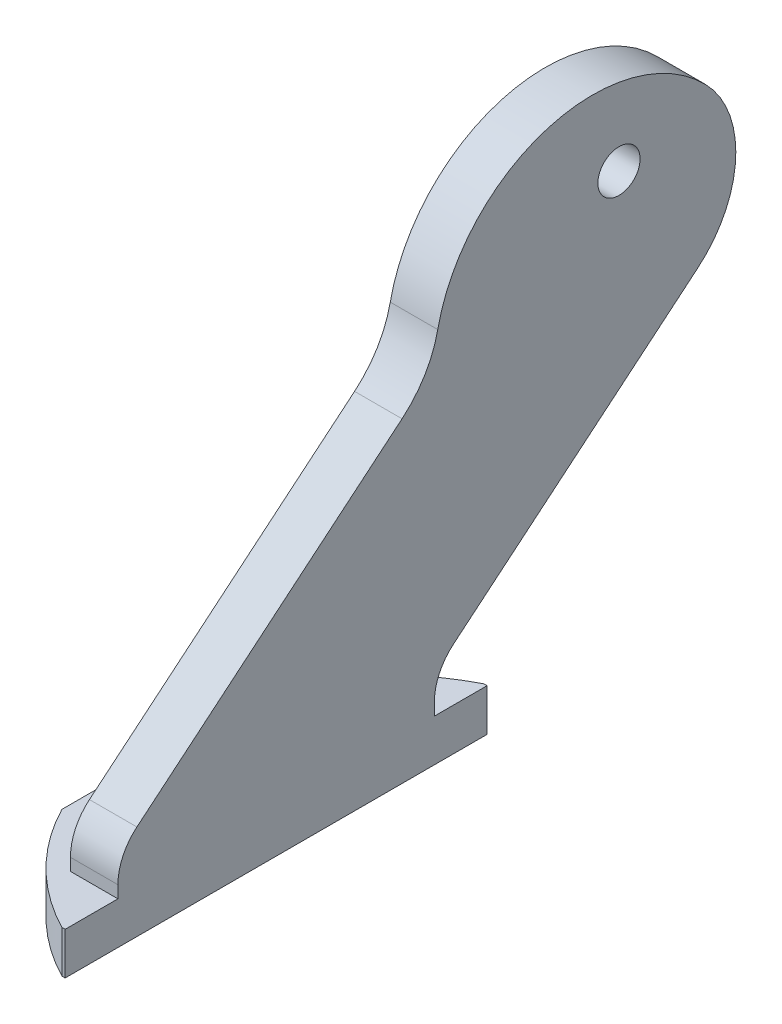
ISO-10303-21;
HEADER;
FILE_DESCRIPTION(('STEP AP214'),'2;1');
FILE_NAME('part.step','',(''),(''),'','','');
FILE_SCHEMA(('AUTOMOTIVE_DESIGN { 1 0 10303 214 1 1 1 1 }'));
ENDSEC;
DATA;
#1=APPLICATION_CONTEXT('core data for automotive mechanical design processes');
#2=APPLICATION_PROTOCOL_DEFINITION('international standard','automotive_design',2000,#1);
#3=PRODUCT_CONTEXT('',#1,'mechanical');
#4=PRODUCT('Part','Part','',(#3));
#5=PRODUCT_RELATED_PRODUCT_CATEGORY('part','',(#4));
#6=PRODUCT_DEFINITION_FORMATION('','',#4);
#7=PRODUCT_DEFINITION_CONTEXT('part definition',#1,'design');
#8=PRODUCT_DEFINITION('design','',#6,#7);
#9=PRODUCT_DEFINITION_SHAPE('','',#8);
#10=(LENGTH_UNIT() NAMED_UNIT(*) SI_UNIT(.MILLI.,.METRE.));
#11=(NAMED_UNIT(*) PLANE_ANGLE_UNIT() SI_UNIT($,.RADIAN.));
#12=(NAMED_UNIT(*) SI_UNIT($,.STERADIAN.) SOLID_ANGLE_UNIT());
#13=UNCERTAINTY_MEASURE_WITH_UNIT(LENGTH_MEASURE(1.E-05),#10,'distance_accuracy_value','');
#14=(GEOMETRIC_REPRESENTATION_CONTEXT(3) GLOBAL_UNCERTAINTY_ASSIGNED_CONTEXT((#13)) GLOBAL_UNIT_ASSIGNED_CONTEXT((#10,
#11,#12)) REPRESENTATION_CONTEXT('',''));
#15=CARTESIAN_POINT('',(0.,0.,0.));
#16=DIRECTION('',(0.,0.,1.));
#17=DIRECTION('',(1.,0.,0.));
#18=AXIS2_PLACEMENT_3D('',#15,#16,#17);
#19=CARTESIAN_POINT('',(-14.5,-79.,14.4460202131937));
#20=DIRECTION('',(0.,1.,0.));
#21=DIRECTION('',(0.,0.,1.));
#22=AXIS2_PLACEMENT_3D('',#19,#20,#21);
#23=CYLINDRICAL_SURFACE('',#22,1.6);
#24=CARTESIAN_POINT('',(-14.5,0.,14.4460202131937));
#25=DIRECTION('',(0.,1.,0.));
#26=DIRECTION('',(0.,0.,1.));
#27=AXIS2_PLACEMENT_3D('',#24,#25,#26);
#28=CIRCLE('',#27,1.6);
#29=CARTESIAN_POINT('',(-14.5,0.,16.0460202131937));
#30=VERTEX_POINT('',#29);
#31=EDGE_CURVE('E220',#30,#30,#28,.T.);
#32=ORIENTED_EDGE('',*,*,#31,.F.);
#33=EDGE_LOOP('',(#32));
#34=FACE_BOUND('',#33,.T.);
#35=CARTESIAN_POINT('',(-14.5,5.,14.4460202131937));
#36=DIRECTION('',(0.,1.,0.));
#37=DIRECTION('',(0.,0.,1.));
#38=AXIS2_PLACEMENT_3D('',#35,#36,#37);
#39=CIRCLE('',#38,1.6);
#40=CARTESIAN_POINT('',(-14.5,5.,16.0460202131937));
#41=VERTEX_POINT('',#40);
#42=EDGE_CURVE('E38',#41,#41,#39,.F.);
#43=ORIENTED_EDGE('',*,*,#42,.F.);
#44=EDGE_LOOP('',(#43));
#45=FACE_BOUND('',#44,.T.);
#46=ADVANCED_FACE('F34',(#34,#45),#23,.F.);
#47=CARTESIAN_POINT('',(-14.5,-79.,0.));
#48=DIRECTION('',(0.,1.,0.));
#49=DIRECTION('',(0.,0.,1.));
#50=AXIS2_PLACEMENT_3D('',#47,#48,#49);
#51=CYLINDRICAL_SURFACE('',#50,1.6);
#52=CARTESIAN_POINT('',(-14.5,0.,0.));
#53=DIRECTION('',(0.,1.,0.));
#54=DIRECTION('',(0.,0.,1.));
#55=AXIS2_PLACEMENT_3D('',#52,#53,#54);
#56=CIRCLE('',#55,1.6);
#57=CARTESIAN_POINT('',(-14.5,0.,1.60000000000001));
#58=VERTEX_POINT('',#57);
#59=EDGE_CURVE('E223',#58,#58,#56,.T.);
#60=ORIENTED_EDGE('',*,*,#59,.F.);
#61=EDGE_LOOP('',(#60));
#62=FACE_BOUND('',#61,.T.);
#63=CARTESIAN_POINT('',(-14.5,5.,0.));
#64=DIRECTION('',(0.,1.,0.));
#65=DIRECTION('',(0.,0.,1.));
#66=AXIS2_PLACEMENT_3D('',#63,#64,#65);
#67=CIRCLE('',#66,1.6);
#68=CARTESIAN_POINT('',(-14.5,5.,1.60000000000001));
#69=VERTEX_POINT('',#68);
#70=EDGE_CURVE('E230',#69,#69,#67,.F.);
#71=ORIENTED_EDGE('',*,*,#70,.F.);
#72=EDGE_LOOP('',(#71));
#73=FACE_BOUND('',#72,.T.);
#74=ADVANCED_FACE('F241',(#62,#73),#51,.F.);
#75=CARTESIAN_POINT('',(-14.5,-79.,-14.4460202131937));
#76=DIRECTION('',(0.,1.,0.));
#77=DIRECTION('',(0.,0.,1.));
#78=AXIS2_PLACEMENT_3D('',#75,#76,#77);
#79=CYLINDRICAL_SURFACE('',#78,1.6);
#80=CARTESIAN_POINT('',(-14.5,0.,-14.4460202131937));
#81=DIRECTION('',(0.,1.,0.));
#82=DIRECTION('',(0.,0.,1.));
#83=AXIS2_PLACEMENT_3D('',#80,#81,#82);
#84=CIRCLE('',#83,1.6);
#85=CARTESIAN_POINT('',(-14.5,0.,-12.8460202131937));
#86=VERTEX_POINT('',#85);
#87=EDGE_CURVE('E161',#86,#86,#84,.T.);
#88=ORIENTED_EDGE('',*,*,#87,.F.);
#89=EDGE_LOOP('',(#88));
#90=FACE_BOUND('',#89,.T.);
#91=CARTESIAN_POINT('',(-14.5,5.,-14.4460202131937));
#92=DIRECTION('',(0.,1.,0.));
#93=DIRECTION('',(0.,0.,1.));
#94=AXIS2_PLACEMENT_3D('',#91,#92,#93);
#95=CIRCLE('',#94,1.6);
#96=CARTESIAN_POINT('',(-14.5,5.,-12.8460202131937));
#97=VERTEX_POINT('',#96);
#98=EDGE_CURVE('E228',#97,#97,#95,.F.);
#99=ORIENTED_EDGE('',*,*,#98,.F.);
#100=EDGE_LOOP('',(#99));
#101=FACE_BOUND('',#100,.T.);
#102=ADVANCED_FACE('F247',(#90,#101),#79,.F.);
#103=CARTESIAN_POINT('',(0.,8.,-40.));
#104=DIRECTION('',(0.,0.,1.));
#105=DIRECTION('',(1.,0.,0.));
#106=AXIS2_PLACEMENT_3D('',#103,#104,#105);
#107=PLANE('',#106);
#108=DIRECTION('',(0.,1.,0.));
#109=VECTOR('',#108,1.);
#110=CARTESIAN_POINT('',(-0.615528128088301,0.,-40.));
#111=LINE('',#110,#109);
#112=CARTESIAN_POINT('',(-0.615528128088301,0.,-40.));
#113=VERTEX_POINT('',#112);
#114=CARTESIAN_POINT('',(-0.615528128088301,8.,-40.));
#115=VERTEX_POINT('',#114);
#116=EDGE_CURVE('E59',#113,#115,#111,.T.);
#117=ORIENTED_EDGE('',*,*,#116,.T.);
#118=DIRECTION('',(-1.,0.,0.));
#119=VECTOR('',#118,1.);
#120=CARTESIAN_POINT('',(0.,8.,-40.));
#121=LINE('',#120,#119);
#122=CARTESIAN_POINT('',(0.,8.,-40.));
#123=VERTEX_POINT('',#122);
#124=EDGE_CURVE('E198',#123,#115,#121,.T.);
#125=ORIENTED_EDGE('',*,*,#124,.F.);
#126=DIRECTION('',(0.,-1.,0.));
#127=VECTOR('',#126,1.);
#128=CARTESIAN_POINT('',(0.,8.,-40.));
#129=LINE('',#128,#127);
#130=CARTESIAN_POINT('',(0.,0.,-40.));
#131=VERTEX_POINT('',#130);
#132=EDGE_CURVE('E11',#123,#131,#129,.T.);
#133=ORIENTED_EDGE('',*,*,#132,.T.);
#134=DIRECTION('',(-1.,0.,0.));
#135=VECTOR('',#134,1.);
#136=CARTESIAN_POINT('',(0.,0.,-40.));
#137=LINE('',#136,#135);
#138=EDGE_CURVE('E208',#131,#113,#137,.T.);
#139=ORIENTED_EDGE('',*,*,#138,.T.);
#140=EDGE_LOOP('',(#117,#125,#133,#139));
#141=FACE_BOUND('',#140,.T.);
#142=ADVANCED_FACE('F314',(#141),#107,.F.);
#143=CARTESIAN_POINT('',(-20.,8.,-40.));
#144=DIRECTION('',(1.,0.,0.));
#145=DIRECTION('',(0.,0.,-1.));
#146=AXIS2_PLACEMENT_3D('',#143,#144,#145);
#147=PLANE('',#146);
#148=DIRECTION('',(0.,1.,0.));
#149=VECTOR('',#148,1.);
#150=CARTESIAN_POINT('',(-20.,0.,20.6155281280883));
#151=LINE('',#150,#149);
#152=CARTESIAN_POINT('',(-20.,0.,20.6155281280883));
#153=VERTEX_POINT('',#152);
#154=CARTESIAN_POINT('',(-20.,8.,20.6155281280883));
#155=VERTEX_POINT('',#154);
#156=EDGE_CURVE('E183',#153,#155,#151,.T.);
#157=ORIENTED_EDGE('',*,*,#156,.T.);
#158=DIRECTION('',(0.,0.,1.));
#159=VECTOR('',#158,1.);
#160=CARTESIAN_POINT('',(-20.,8.,-40.));
#161=LINE('',#160,#159);
#162=CARTESIAN_POINT('',(-20.,8.,-20.6155281280883));
#163=VERTEX_POINT('',#162);
#164=EDGE_CURVE('E202',#163,#155,#161,.T.);
#165=ORIENTED_EDGE('',*,*,#164,.F.);
#166=DIRECTION('',(0.,1.,0.));
#167=VECTOR('',#166,1.);
#168=CARTESIAN_POINT('',(-20.,0.,-20.6155281280883));
#169=LINE('',#168,#167);
#170=CARTESIAN_POINT('',(-20.,0.,-20.6155281280883));
#171=VERTEX_POINT('',#170);
#172=EDGE_CURVE('E186',#171,#163,#169,.T.);
#173=ORIENTED_EDGE('',*,*,#172,.F.);
#174=DIRECTION('',(0.,0.,1.));
#175=VECTOR('',#174,1.);
#176=CARTESIAN_POINT('',(-20.,0.,-40.));
#177=LINE('',#176,#175);
#178=EDGE_CURVE('E211',#171,#153,#177,.T.);
#179=ORIENTED_EDGE('',*,*,#178,.T.);
#180=EDGE_LOOP('',(#157,#165,#173,#179));
#181=FACE_BOUND('',#180,.T.);
#182=ADVANCED_FACE('F311',(#181),#147,.F.);
#183=CARTESIAN_POINT('',(-20.,8.,40.));
#184=DIRECTION('',(0.,0.,-1.));
#185=DIRECTION('',(-1.,0.,0.));
#186=AXIS2_PLACEMENT_3D('',#183,#184,#185);
#187=PLANE('',#186);
#188=DIRECTION('',(0.,1.,0.));
#189=VECTOR('',#188,1.);
#190=CARTESIAN_POINT('',(-0.615528128088301,0.,40.));
#191=LINE('',#190,#189);
#192=CARTESIAN_POINT('',(-0.615528128088301,0.,40.));
#193=VERTEX_POINT('',#192);
#194=CARTESIAN_POINT('',(-0.615528128088301,8.,40.));
#195=VERTEX_POINT('',#194);
#196=EDGE_CURVE('E187',#193,#195,#191,.T.);
#197=ORIENTED_EDGE('',*,*,#196,.F.);
#198=DIRECTION('',(1.,0.,0.));
#199=VECTOR('',#198,1.);
#200=CARTESIAN_POINT('',(-20.,0.,40.));
#201=LINE('',#200,#199);
#202=CARTESIAN_POINT('',(0.,0.,40.));
#203=VERTEX_POINT('',#202);
#204=EDGE_CURVE('E214',#193,#203,#201,.T.);
#205=ORIENTED_EDGE('',*,*,#204,.T.);
#206=DIRECTION('',(0.,-1.,0.));
#207=VECTOR('',#206,1.);
#208=CARTESIAN_POINT('',(0.,8.,40.));
#209=LINE('',#208,#207);
#210=CARTESIAN_POINT('',(0.,8.,40.));
#211=VERTEX_POINT('',#210);
#212=EDGE_CURVE('E43',#211,#203,#209,.T.);
#213=ORIENTED_EDGE('',*,*,#212,.F.);
#214=DIRECTION('',(1.,0.,0.));
#215=VECTOR('',#214,1.);
#216=CARTESIAN_POINT('',(-20.,8.,40.));
#217=LINE('',#216,#215);
#218=EDGE_CURVE('E205',#195,#211,#217,.T.);
#219=ORIENTED_EDGE('',*,*,#218,.F.);
#220=EDGE_LOOP('',(#197,#205,#213,#219));
#221=FACE_BOUND('',#220,.T.);
#222=ADVANCED_FACE('F304',(#221),#187,.F.);
#223=CARTESIAN_POINT('',(0.,8.,0.));
#224=DIRECTION('',(0.,1.,0.));
#225=DIRECTION('',(0.,0.,1.));
#226=AXIS2_PLACEMENT_3D('',#223,#224,#225);
#227=PLANE('',#226);
#228=CARTESIAN_POINT('',(-14.5,8.,-14.4460202131937));
#229=DIRECTION('',(0.,1.,0.));
#230=DIRECTION('',(0.,0.,1.));
#231=AXIS2_PLACEMENT_3D('',#228,#229,#230);
#232=CIRCLE('',#231,3.25);
#233=CARTESIAN_POINT('',(-14.5,8.,-11.1960202131937));
#234=VERTEX_POINT('',#233);
#235=EDGE_CURVE('E626',#234,#234,#232,.T.);
#236=ORIENTED_EDGE('',*,*,#235,.F.);
#237=EDGE_LOOP('',(#236));
#238=FACE_BOUND('',#237,.T.);
#239=CARTESIAN_POINT('',(-14.5,8.,0.));
#240=DIRECTION('',(0.,1.,0.));
#241=DIRECTION('',(0.,0.,1.));
#242=AXIS2_PLACEMENT_3D('',#239,#240,#241);
#243=CIRCLE('',#242,3.25);
#244=CARTESIAN_POINT('',(-14.5,8.,3.25));
#245=VERTEX_POINT('',#244);
#246=EDGE_CURVE('E604',#245,#245,#243,.T.);
#247=ORIENTED_EDGE('',*,*,#246,.F.);
#248=EDGE_LOOP('',(#247));
#249=FACE_BOUND('',#248,.T.);
#250=CARTESIAN_POINT('',(-14.5,8.,14.4460202131937));
#251=DIRECTION('',(0.,1.,0.));
#252=DIRECTION('',(0.,0.,1.));
#253=AXIS2_PLACEMENT_3D('',#250,#251,#252);
#254=CIRCLE('',#253,3.25);
#255=CARTESIAN_POINT('',(-14.5,8.,17.6960202131937));
#256=VERTEX_POINT('',#255);
#257=EDGE_CURVE('E601',#256,#256,#254,.T.);
#258=ORIENTED_EDGE('',*,*,#257,.F.);
#259=EDGE_LOOP('',(#258));
#260=FACE_BOUND('',#259,.T.);
#261=CARTESIAN_POINT('',(20.,8.,0.));
#262=DIRECTION('',(0.,1.,0.));
#263=DIRECTION('',(0.,0.,1.));
#264=AXIS2_PLACEMENT_3D('',#261,#262,#263);
#265=CIRCLE('',#264,45.);
#266=EDGE_CURVE('E173',#115,#163,#265,.T.);
#267=ORIENTED_EDGE('',*,*,#266,.T.);
#268=ORIENTED_EDGE('',*,*,#164,.T.);
#269=CARTESIAN_POINT('',(20.,8.,0.));
#270=DIRECTION('',(0.,1.,0.));
#271=DIRECTION('',(0.,0.,1.));
#272=AXIS2_PLACEMENT_3D('',#269,#270,#271);
#273=CIRCLE('',#272,45.);
#274=EDGE_CURVE('E184',#155,#195,#273,.T.);
#275=ORIENTED_EDGE('',*,*,#274,.T.);
#276=ORIENTED_EDGE('',*,*,#218,.T.);
#277=DIRECTION('',(0.,0.,-1.));
#278=VECTOR('',#277,1.);
#279=CARTESIAN_POINT('',(0.,8.,-40.));
#280=LINE('',#279,#278);
#281=CARTESIAN_POINT('',(0.,8.,30.));
#282=VERTEX_POINT('',#281);
#283=EDGE_CURVE('E171',#211,#282,#280,.T.);
#284=ORIENTED_EDGE('',*,*,#283,.T.);
#285=DIRECTION('',(1.,0.,0.));
#286=VECTOR('',#285,1.);
#287=CARTESIAN_POINT('',(0.,8.,30.));
#288=LINE('',#287,#286);
#289=CARTESIAN_POINT('',(-9.,8.00000000000001,30.));
#290=VERTEX_POINT('',#289);
#291=EDGE_CURVE('E51',#290,#282,#288,.T.);
#292=ORIENTED_EDGE('',*,*,#291,.F.);
#293=DIRECTION('',(0.,0.,-1.));
#294=VECTOR('',#293,1.);
#295=CARTESIAN_POINT('',(-9.,8.00000000000001,-87.1493241194241));
#296=LINE('',#295,#294);
#297=CARTESIAN_POINT('',(-9.,8.00000000000001,-30.));
#298=VERTEX_POINT('',#297);
#299=EDGE_CURVE('E150',#290,#298,#296,.T.);
#300=ORIENTED_EDGE('',*,*,#299,.T.);
#301=DIRECTION('',(-1.,0.,0.));
#302=VECTOR('',#301,1.);
#303=CARTESIAN_POINT('',(0.,8.,-30.));
#304=LINE('',#303,#302);
#305=CARTESIAN_POINT('',(0.,8.,-30.));
#306=VERTEX_POINT('',#305);
#307=EDGE_CURVE('E174',#306,#298,#304,.T.);
#308=ORIENTED_EDGE('',*,*,#307,.F.);
#309=EDGE_CURVE('E199',#306,#123,#280,.T.);
#310=ORIENTED_EDGE('',*,*,#309,.T.);
#311=ORIENTED_EDGE('',*,*,#124,.T.);
#312=EDGE_LOOP('',(#267,#268,#275,#276,#284,#292,#300,#308,#310,#311));
#313=FACE_BOUND('',#312,.T.);
#314=ADVANCED_FACE('F169',(#238,#249,#260,#313),#227,.T.);
#315=CARTESIAN_POINT('',(0.,0.,0.));
#316=DIRECTION('',(0.,1.,0.));
#317=DIRECTION('',(0.,0.,1.));
#318=AXIS2_PLACEMENT_3D('',#315,#316,#317);
#319=PLANE('',#318);
#320=ORIENTED_EDGE('',*,*,#87,.T.);
#321=EDGE_LOOP('',(#320));
#322=FACE_BOUND('',#321,.T.);
#323=ORIENTED_EDGE('',*,*,#59,.T.);
#324=EDGE_LOOP('',(#323));
#325=FACE_BOUND('',#324,.T.);
#326=ORIENTED_EDGE('',*,*,#31,.T.);
#327=EDGE_LOOP('',(#326));
#328=FACE_BOUND('',#327,.T.);
#329=ORIENTED_EDGE('',*,*,#138,.F.);
#330=DIRECTION('',(0.,0.,-1.));
#331=VECTOR('',#330,1.);
#332=CARTESIAN_POINT('',(0.,0.,-40.));
#333=LINE('',#332,#331);
#334=EDGE_CURVE('E190',#203,#131,#333,.T.);
#335=ORIENTED_EDGE('',*,*,#334,.F.);
#336=ORIENTED_EDGE('',*,*,#204,.F.);
#337=CARTESIAN_POINT('',(20.,0.,0.));
#338=DIRECTION('',(0.,1.,0.));
#339=DIRECTION('',(0.,0.,1.));
#340=AXIS2_PLACEMENT_3D('',#337,#338,#339);
#341=CIRCLE('',#340,45.);
#342=EDGE_CURVE('E181',#153,#193,#341,.T.);
#343=ORIENTED_EDGE('',*,*,#342,.F.);
#344=ORIENTED_EDGE('',*,*,#178,.F.);
#345=CARTESIAN_POINT('',(20.,0.,0.));
#346=DIRECTION('',(0.,1.,0.));
#347=DIRECTION('',(0.,0.,1.));
#348=AXIS2_PLACEMENT_3D('',#345,#346,#347);
#349=CIRCLE('',#348,45.);
#350=EDGE_CURVE('E176',#113,#171,#349,.T.);
#351=ORIENTED_EDGE('',*,*,#350,.F.);
#352=EDGE_LOOP('',(#329,#335,#336,#343,#344,#351));
#353=FACE_BOUND('',#352,.T.);
#354=ADVANCED_FACE('F303',(#322,#325,#328,#353),#319,.F.);
#355=CARTESIAN_POINT('',(0.,8.,-40.));
#356=DIRECTION('',(-1.,0.,0.));
#357=DIRECTION('',(0.,0.,1.));
#358=AXIS2_PLACEMENT_3D('',#355,#356,#357);
#359=PLANE('',#358);
#360=ORIENTED_EDGE('',*,*,#309,.F.);
#361=DIRECTION('',(0.,1.,0.));
#362=VECTOR('',#361,1.);
#363=CARTESIAN_POINT('',(0.,0.,-30.));
#364=LINE('',#363,#362);
#365=CARTESIAN_POINT('',(0.,10.3162505401555,-30.));
#366=VERTEX_POINT('',#365);
#367=EDGE_CURVE('E330',#306,#366,#364,.T.);
#368=ORIENTED_EDGE('',*,*,#367,.T.);
#369=CARTESIAN_POINT('',(0.,10.3162505401556,-40.));
#370=DIRECTION('',(-1.,0.,0.));
#371=DIRECTION('',(0.,0.,1.));
#372=AXIS2_PLACEMENT_3D('',#369,#370,#371);
#373=CIRCLE('',#372,10.);
#374=CARTESIAN_POINT('',(0.,17.9984633361294,-33.5981560033552));
#375=VERTEX_POINT('',#374);
#376=EDGE_CURVE('E369',#366,#375,#373,.T.);
#377=ORIENTED_EDGE('',*,*,#376,.T.);
#378=DIRECTION('',(0.,0.64018439966448,-0.768221279597376));
#379=VECTOR('',#378,1.);
#380=CARTESIAN_POINT('',(0.,56.6275100939281,-79.9530121127137));
#381=LINE('',#380,#379);
#382=CARTESIAN_POINT('',(0.,56.6275100939281,-79.9530121127137));
#383=VERTEX_POINT('',#382);
#384=EDGE_CURVE('E373',#375,#383,#381,.T.);
#385=ORIENTED_EDGE('',*,*,#384,.T.);
#386=CARTESIAN_POINT('',(0.,71.9919356858756,-67.1493241194241));
#387=DIRECTION('',(1.,0.,0.));
#388=DIRECTION('',(0.,0.,-1.));
#389=AXIS2_PLACEMENT_3D('',#386,#387,#388);
#390=CIRCLE('',#389,20.);
#391=CARTESIAN_POINT('',(0.,85.9758070576268,-81.4479723582723));
#392=VERTEX_POINT('',#391);
#393=EDGE_CURVE('E377',#383,#392,#390,.T.);
#394=ORIENTED_EDGE('',*,*,#393,.T.);
#395=CARTESIAN_POINT('',(0.,65.,-60.));
#396=DIRECTION('',(1.,0.,0.));
#397=DIRECTION('',(0.,0.,1.));
#398=AXIS2_PLACEMENT_3D('',#395,#396,#397);
#399=CIRCLE('',#398,30.);
#400=CARTESIAN_POINT('',(0.,71.1517566814215,-30.6375087955299));
#401=VERTEX_POINT('',#400);
#402=EDGE_CURVE('E384',#392,#401,#399,.T.);
#403=ORIENTED_EDGE('',*,*,#402,.T.);
#404=CARTESIAN_POINT('',(0.,75.2529278023692,-11.0625146592165));
#405=DIRECTION('',(-1.,0.,0.));
#406=DIRECTION('',(0.,0.,-1.));
#407=AXIS2_PLACEMENT_3D('',#404,#405,#406);
#408=CIRCLE('',#407,20.);
#409=CARTESIAN_POINT('',(0.,59.8885022104217,-23.8662026525061));
#410=VERTEX_POINT('',#409);
#411=EDGE_CURVE('E387',#401,#410,#408,.T.);
#412=ORIENTED_EDGE('',*,*,#411,.T.);
#413=DIRECTION('',(0.,-0.64018439966448,0.768221279597376));
#414=VECTOR('',#413,1.);
#415=CARTESIAN_POINT('',(0.,59.8885022104217,-23.8662026525061));
#416=LINE('',#415,#414);
#417=CARTESIAN_POINT('',(0.,17.9984633361294,26.4018439966448));
#418=VERTEX_POINT('',#417);
#419=EDGE_CURVE('E350',#410,#418,#416,.T.);
#420=ORIENTED_EDGE('',*,*,#419,.T.);
#421=CARTESIAN_POINT('',(0.,10.3162505401556,20.));
#422=DIRECTION('',(1.,0.,0.));
#423=DIRECTION('',(0.,0.,1.));
#424=AXIS2_PLACEMENT_3D('',#421,#422,#423);
#425=CIRCLE('',#424,10.);
#426=CARTESIAN_POINT('',(0.,10.3162505401555,30.));
#427=VERTEX_POINT('',#426);
#428=EDGE_CURVE('E346',#418,#427,#425,.T.);
#429=ORIENTED_EDGE('',*,*,#428,.T.);
#430=DIRECTION('',(0.,-1.,0.));
#431=VECTOR('',#430,1.);
#432=CARTESIAN_POINT('',(0.,0.,30.));
#433=LINE('',#432,#431);
#434=EDGE_CURVE('E343',#427,#282,#433,.T.);
#435=ORIENTED_EDGE('',*,*,#434,.T.);
#436=ORIENTED_EDGE('',*,*,#283,.F.);
#437=ORIENTED_EDGE('',*,*,#212,.T.);
#438=ORIENTED_EDGE('',*,*,#334,.T.);
#439=ORIENTED_EDGE('',*,*,#132,.F.);
#440=EDGE_LOOP('',(#360,#368,#377,#385,#394,#403,#412,#420,#429,#435,#436,#437,#438,#439));
#441=FACE_BOUND('',#440,.T.);
#442=CARTESIAN_POINT('',(0.,80.,-65.));
#443=DIRECTION('',(1.,0.,0.));
#444=DIRECTION('',(0.,0.,-1.));
#445=AXIS2_PLACEMENT_3D('',#442,#443,#444);
#446=CIRCLE('',#445,4.00000000000001);
#447=CARTESIAN_POINT('',(0.,80.,-69.));
#448=VERTEX_POINT('',#447);
#449=EDGE_CURVE('E166',#448,#448,#446,.T.);
#450=ORIENTED_EDGE('',*,*,#449,.F.);
#451=EDGE_LOOP('',(#450));
#452=FACE_BOUND('',#451,.T.);
#453=ADVANCED_FACE('F36',(#441,#452),#359,.F.);
#454=CARTESIAN_POINT('',(20.,0.,0.));
#455=DIRECTION('',(0.,1.,0.));
#456=DIRECTION('',(0.,0.,1.));
#457=AXIS2_PLACEMENT_3D('',#454,#455,#456);
#458=CYLINDRICAL_SURFACE('',#457,45.);
#459=ORIENTED_EDGE('',*,*,#266,.F.);
#460=ORIENTED_EDGE('',*,*,#116,.F.);
#461=ORIENTED_EDGE('',*,*,#350,.T.);
#462=ORIENTED_EDGE('',*,*,#172,.T.);
#463=EDGE_LOOP('',(#459,#460,#461,#462));
#464=FACE_BOUND('',#463,.T.);
#465=ADVANCED_FACE('F297',(#464),#458,.T.);
#466=CARTESIAN_POINT('',(20.,0.,0.));
#467=DIRECTION('',(0.,1.,0.));
#468=DIRECTION('',(0.,0.,1.));
#469=AXIS2_PLACEMENT_3D('',#466,#467,#468);
#470=CYLINDRICAL_SURFACE('',#469,45.);
#471=ORIENTED_EDGE('',*,*,#274,.F.);
#472=ORIENTED_EDGE('',*,*,#156,.F.);
#473=ORIENTED_EDGE('',*,*,#342,.T.);
#474=ORIENTED_EDGE('',*,*,#196,.T.);
#475=EDGE_LOOP('',(#471,#472,#473,#474));
#476=FACE_BOUND('',#475,.T.);
#477=ADVANCED_FACE('F264',(#476),#470,.T.);
#478=CARTESIAN_POINT('',(-13.,0.,30.));
#479=DIRECTION('',(0.,0.,1.));
#480=DIRECTION('',(1.,0.,0.));
#481=AXIS2_PLACEMENT_3D('',#478,#479,#480);
#482=PLANE('',#481);
#483=DIRECTION('',(0.,1.,0.));
#484=VECTOR('',#483,1.);
#485=CARTESIAN_POINT('',(-9.,0.,30.));
#486=LINE('',#485,#484);
#487=CARTESIAN_POINT('',(-9.,10.3162505401555,30.));
#488=VERTEX_POINT('',#487);
#489=EDGE_CURVE('E153',#290,#488,#486,.T.);
#490=ORIENTED_EDGE('',*,*,#489,.F.);
#491=ORIENTED_EDGE('',*,*,#291,.T.);
#492=ORIENTED_EDGE('',*,*,#434,.F.);
#493=DIRECTION('',(1.,0.,0.));
#494=VECTOR('',#493,1.);
#495=CARTESIAN_POINT('',(-13.,10.3162505401555,30.));
#496=LINE('',#495,#494);
#497=EDGE_CURVE('E165',#488,#427,#496,.T.);
#498=ORIENTED_EDGE('',*,*,#497,.F.);
#499=EDGE_LOOP('',(#490,#491,#492,#498));
#500=FACE_BOUND('',#499,.T.);
#501=ADVANCED_FACE('F164',(#500),#482,.T.);
#502=CARTESIAN_POINT('',(-13.,10.3162505401556,20.));
#503=DIRECTION('',(1.,0.,0.));
#504=DIRECTION('',(0.,0.,-1.));
#505=AXIS2_PLACEMENT_3D('',#502,#503,#504);
#506=CYLINDRICAL_SURFACE('',#505,10.);
#507=CARTESIAN_POINT('',(-9.,10.3162505401556,20.));
#508=DIRECTION('',(1.,0.,0.));
#509=DIRECTION('',(0.,0.,-1.));
#510=AXIS2_PLACEMENT_3D('',#507,#508,#509);
#511=CIRCLE('',#510,10.);
#512=CARTESIAN_POINT('',(-9.,17.9984633361294,26.4018439966448));
#513=VERTEX_POINT('',#512);
#514=EDGE_CURVE('E167',#488,#513,#511,.F.);
#515=ORIENTED_EDGE('',*,*,#514,.F.);
#516=ORIENTED_EDGE('',*,*,#497,.T.);
#517=ORIENTED_EDGE('',*,*,#428,.F.);
#518=DIRECTION('',(1.,0.,0.));
#519=VECTOR('',#518,1.);
#520=CARTESIAN_POINT('',(-13.,17.9984633361294,26.4018439966448));
#521=LINE('',#520,#519);
#522=EDGE_CURVE('E355',#513,#418,#521,.T.);
#523=ORIENTED_EDGE('',*,*,#522,.F.);
#524=EDGE_LOOP('',(#515,#516,#517,#523));
#525=FACE_BOUND('',#524,.T.);
#526=ADVANCED_FACE('F263',(#525),#506,.T.);
#527=CARTESIAN_POINT('',(-13.,59.8885022104217,-23.8662026525061));
#528=DIRECTION('',(0.,0.768221279597376,0.64018439966448));
#529=DIRECTION('',(0.,-0.64018439966448,0.768221279597376));
#530=AXIS2_PLACEMENT_3D('',#527,#528,#529);
#531=PLANE('',#530);
#532=DIRECTION('',(0.,0.64018439966448,-0.768221279597376));
#533=VECTOR('',#532,1.);
#534=CARTESIAN_POINT('',(-9.,59.8885022104217,-23.8662026525061));
#535=LINE('',#534,#533);
#536=CARTESIAN_POINT('',(-9.,59.8885022104217,-23.8662026525061));
#537=VERTEX_POINT('',#536);
#538=EDGE_CURVE('E394',#513,#537,#535,.T.);
#539=ORIENTED_EDGE('',*,*,#538,.F.);
#540=ORIENTED_EDGE('',*,*,#522,.T.);
#541=ORIENTED_EDGE('',*,*,#419,.F.);
#542=DIRECTION('',(1.,0.,0.));
#543=VECTOR('',#542,1.);
#544=CARTESIAN_POINT('',(-13.,59.8885022104217,-23.8662026525061));
#545=LINE('',#544,#543);
#546=EDGE_CURVE('E357',#537,#410,#545,.T.);
#547=ORIENTED_EDGE('',*,*,#546,.F.);
#548=EDGE_LOOP('',(#539,#540,#541,#547));
#549=FACE_BOUND('',#548,.T.);
#550=ADVANCED_FACE('F267',(#549),#531,.T.);
#551=CARTESIAN_POINT('',(-13.,75.2529278023692,-11.0625146592165));
#552=DIRECTION('',(1.,0.,0.));
#553=DIRECTION('',(0.,0.,-1.));
#554=AXIS2_PLACEMENT_3D('',#551,#552,#553);
#555=CYLINDRICAL_SURFACE('',#554,20.);
#556=CARTESIAN_POINT('',(-9.,75.2529278023692,-11.0625146592165));
#557=DIRECTION('',(1.,0.,0.));
#558=DIRECTION('',(0.,0.,-1.));
#559=AXIS2_PLACEMENT_3D('',#556,#557,#558);
#560=CIRCLE('',#559,20.);
#561=CARTESIAN_POINT('',(-9.,71.1517566814215,-30.6375087955299));
#562=VERTEX_POINT('',#561);
#563=EDGE_CURVE('E396',#537,#562,#560,.T.);
#564=ORIENTED_EDGE('',*,*,#563,.F.);
#565=ORIENTED_EDGE('',*,*,#546,.T.);
#566=ORIENTED_EDGE('',*,*,#411,.F.);
#567=DIRECTION('',(1.,0.,0.));
#568=VECTOR('',#567,1.);
#569=CARTESIAN_POINT('',(-13.,71.1517566814215,-30.6375087955299));
#570=LINE('',#569,#568);
#571=EDGE_CURVE('E359',#562,#401,#570,.T.);
#572=ORIENTED_EDGE('',*,*,#571,.F.);
#573=EDGE_LOOP('',(#564,#565,#566,#572));
#574=FACE_BOUND('',#573,.T.);
#575=ADVANCED_FACE('F271',(#574),#555,.F.);
#576=CARTESIAN_POINT('',(-13.,65.,-60.));
#577=DIRECTION('',(1.,0.,0.));
#578=DIRECTION('',(0.,0.,-1.));
#579=AXIS2_PLACEMENT_3D('',#576,#577,#578);
#580=CYLINDRICAL_SURFACE('',#579,30.);
#581=CARTESIAN_POINT('',(-9.,65.,-60.));
#582=DIRECTION('',(1.,0.,0.));
#583=DIRECTION('',(0.,0.,-1.));
#584=AXIS2_PLACEMENT_3D('',#581,#582,#583);
#585=CIRCLE('',#584,30.);
#586=CARTESIAN_POINT('',(-9.,85.9758070576268,-81.4479723582723));
#587=VERTEX_POINT('',#586);
#588=EDGE_CURVE('E614',#562,#587,#585,.F.);
#589=ORIENTED_EDGE('',*,*,#588,.F.);
#590=ORIENTED_EDGE('',*,*,#571,.T.);
#591=ORIENTED_EDGE('',*,*,#402,.F.);
#592=DIRECTION('',(1.,0.,0.));
#593=VECTOR('',#592,1.);
#594=CARTESIAN_POINT('',(-13.,85.9758070576268,-81.4479723582723));
#595=LINE('',#594,#593);
#596=EDGE_CURVE('E361',#587,#392,#595,.T.);
#597=ORIENTED_EDGE('',*,*,#596,.F.);
#598=EDGE_LOOP('',(#589,#590,#591,#597));
#599=FACE_BOUND('',#598,.T.);
#600=ADVANCED_FACE('F275',(#599),#580,.T.);
#601=CARTESIAN_POINT('',(-13.,71.9919356858756,-67.1493241194241));
#602=DIRECTION('',(1.,0.,0.));
#603=DIRECTION('',(0.,0.,-1.));
#604=AXIS2_PLACEMENT_3D('',#601,#602,#603);
#605=CYLINDRICAL_SURFACE('',#604,20.);
#606=DIRECTION('',(1.,0.,0.));
#607=VECTOR('',#606,1.);
#608=CARTESIAN_POINT('',(-13.,56.6275100939281,-79.9530121127137));
#609=LINE('',#608,#607);
#610=CARTESIAN_POINT('',(-9.,56.6275100939281,-79.9530121127137));
#611=VERTEX_POINT('',#610);
#612=EDGE_CURVE('E363',#611,#383,#609,.T.);
#613=ORIENTED_EDGE('',*,*,#612,.F.);
#614=CARTESIAN_POINT('',(-9.,71.9919356858756,-67.1493241194241));
#615=DIRECTION('',(1.,0.,0.));
#616=DIRECTION('',(0.,0.,-1.));
#617=AXIS2_PLACEMENT_3D('',#614,#615,#616);
#618=CIRCLE('',#617,20.);
#619=EDGE_CURVE('E612',#587,#611,#618,.F.);
#620=ORIENTED_EDGE('',*,*,#619,.F.);
#621=ORIENTED_EDGE('',*,*,#596,.T.);
#622=ORIENTED_EDGE('',*,*,#393,.F.);
#623=EDGE_LOOP('',(#613,#620,#621,#622));
#624=FACE_BOUND('',#623,.T.);
#625=ADVANCED_FACE('F279',(#624),#605,.T.);
#626=CARTESIAN_POINT('',(-13.,56.6275100939281,-79.9530121127137));
#627=DIRECTION('',(0.,-0.768221279597376,-0.64018439966448));
#628=DIRECTION('',(0.,0.64018439966448,-0.768221279597376));
#629=AXIS2_PLACEMENT_3D('',#626,#627,#628);
#630=PLANE('',#629);
#631=DIRECTION('',(0.,-0.64018439966448,0.768221279597376));
#632=VECTOR('',#631,1.);
#633=CARTESIAN_POINT('',(-9.,56.6275100939281,-79.9530121127137));
#634=LINE('',#633,#632);
#635=CARTESIAN_POINT('',(-9.,17.9984633361294,-33.5981560033552));
#636=VERTEX_POINT('',#635);
#637=EDGE_CURVE('E610',#611,#636,#634,.T.);
#638=ORIENTED_EDGE('',*,*,#637,.F.);
#639=ORIENTED_EDGE('',*,*,#612,.T.);
#640=ORIENTED_EDGE('',*,*,#384,.F.);
#641=DIRECTION('',(1.,0.,0.));
#642=VECTOR('',#641,1.);
#643=CARTESIAN_POINT('',(-13.,17.9984633361294,-33.5981560033552));
#644=LINE('',#643,#642);
#645=EDGE_CURVE('E349',#636,#375,#644,.T.);
#646=ORIENTED_EDGE('',*,*,#645,.F.);
#647=EDGE_LOOP('',(#638,#639,#640,#646));
#648=FACE_BOUND('',#647,.T.);
#649=ADVANCED_FACE('F283',(#648),#630,.T.);
#650=CARTESIAN_POINT('',(-13.,10.3162505401556,-40.));
#651=DIRECTION('',(1.,0.,0.));
#652=DIRECTION('',(0.,0.,-1.));
#653=AXIS2_PLACEMENT_3D('',#650,#651,#652);
#654=CYLINDRICAL_SURFACE('',#653,10.);
#655=CARTESIAN_POINT('',(-9.,10.3162505401556,-40.));
#656=DIRECTION('',(1.,0.,0.));
#657=DIRECTION('',(0.,0.,-1.));
#658=AXIS2_PLACEMENT_3D('',#655,#656,#657);
#659=CIRCLE('',#658,10.);
#660=CARTESIAN_POINT('',(-9.,10.3162505401555,-30.));
#661=VERTEX_POINT('',#660);
#662=EDGE_CURVE('E370',#636,#661,#659,.T.);
#663=ORIENTED_EDGE('',*,*,#662,.F.);
#664=ORIENTED_EDGE('',*,*,#645,.T.);
#665=ORIENTED_EDGE('',*,*,#376,.F.);
#666=DIRECTION('',(1.,0.,0.));
#667=VECTOR('',#666,1.);
#668=CARTESIAN_POINT('',(-13.,10.3162505401555,-30.));
#669=LINE('',#668,#667);
#670=EDGE_CURVE('E347',#661,#366,#669,.T.);
#671=ORIENTED_EDGE('',*,*,#670,.F.);
#672=EDGE_LOOP('',(#663,#664,#665,#671));
#673=FACE_BOUND('',#672,.T.);
#674=ADVANCED_FACE('F287',(#673),#654,.F.);
#675=CARTESIAN_POINT('',(-13.,0.,-30.));
#676=DIRECTION('',(0.,0.,-1.));
#677=DIRECTION('',(-1.,0.,0.));
#678=AXIS2_PLACEMENT_3D('',#675,#676,#677);
#679=PLANE('',#678);
#680=DIRECTION('',(0.,-1.,0.));
#681=VECTOR('',#680,1.);
#682=CARTESIAN_POINT('',(-9.,0.,-30.));
#683=LINE('',#682,#681);
#684=EDGE_CURVE('E156',#661,#298,#683,.T.);
#685=ORIENTED_EDGE('',*,*,#684,.F.);
#686=ORIENTED_EDGE('',*,*,#670,.T.);
#687=ORIENTED_EDGE('',*,*,#367,.F.);
#688=ORIENTED_EDGE('',*,*,#307,.T.);
#689=EDGE_LOOP('',(#685,#686,#687,#688));
#690=FACE_BOUND('',#689,.T.);
#691=ADVANCED_FACE('F259',(#690),#679,.T.);
#692=CARTESIAN_POINT('',(-13.,80.,-65.));
#693=DIRECTION('',(1.,0.,0.));
#694=DIRECTION('',(0.,0.,-1.));
#695=AXIS2_PLACEMENT_3D('',#692,#693,#694);
#696=CYLINDRICAL_SURFACE('',#695,4.00000000000001);
#697=CARTESIAN_POINT('',(-9.,80.,-65.));
#698=DIRECTION('',(1.,0.,0.));
#699=DIRECTION('',(0.,0.,-1.));
#700=AXIS2_PLACEMENT_3D('',#697,#698,#699);
#701=CIRCLE('',#700,4.00000000000001);
#702=CARTESIAN_POINT('',(-9.,80.,-69.));
#703=VERTEX_POINT('',#702);
#704=EDGE_CURVE('E160',#703,#703,#701,.F.);
#705=CARTESIAN_POINT('',(-9.,80.,-69.));
#706=CARTESIAN_POINT('',(-8.90625,80.,-69.));
#707=CARTESIAN_POINT('',(-8.8125,80.,-69.));
#708=CARTESIAN_POINT('',(-8.625,80.,-69.));
#709=CARTESIAN_POINT('',(-8.53125,80.,-69.));
#710=CARTESIAN_POINT('',(-8.34375,80.,-69.));
#711=CARTESIAN_POINT('',(-8.25,80.,-69.));
#712=CARTESIAN_POINT('',(-8.0625,80.,-69.));
#713=CARTESIAN_POINT('',(-7.96875,80.,-69.));
#714=CARTESIAN_POINT('',(-7.78125,80.,-69.));
#715=CARTESIAN_POINT('',(-7.6875,80.,-69.));
#716=CARTESIAN_POINT('',(-7.5,80.,-69.));
#717=CARTESIAN_POINT('',(-7.40625,80.,-69.));
#718=CARTESIAN_POINT('',(-7.21875,80.,-69.));
#719=CARTESIAN_POINT('',(-7.125,80.,-69.));
#720=CARTESIAN_POINT('',(-6.9375,80.,-69.));
#721=CARTESIAN_POINT('',(-6.84375,80.,-69.));
#722=CARTESIAN_POINT('',(-6.65625,80.,-69.));
#723=CARTESIAN_POINT('',(-6.5625,80.,-69.));
#724=CARTESIAN_POINT('',(-6.375,80.,-69.));
#725=CARTESIAN_POINT('',(-6.28125,80.,-69.));
#726=CARTESIAN_POINT('',(-6.09375,80.,-69.));
#727=CARTESIAN_POINT('',(-6.,80.,-69.));
#728=CARTESIAN_POINT('',(-5.8125,80.,-69.));
#729=CARTESIAN_POINT('',(-5.71875,80.,-69.));
#730=CARTESIAN_POINT('',(-5.53125,80.,-69.));
#731=CARTESIAN_POINT('',(-5.4375,80.,-69.));
#732=CARTESIAN_POINT('',(-5.25,80.,-69.));
#733=CARTESIAN_POINT('',(-5.15625,80.,-69.));
#734=CARTESIAN_POINT('',(-4.96875,80.,-69.));
#735=CARTESIAN_POINT('',(-4.875,80.,-69.));
#736=CARTESIAN_POINT('',(-4.6875,80.,-69.));
#737=CARTESIAN_POINT('',(-4.59375,80.,-69.));
#738=CARTESIAN_POINT('',(-4.40625,80.,-69.));
#739=CARTESIAN_POINT('',(-4.3125,80.,-69.));
#740=CARTESIAN_POINT('',(-4.125,80.,-69.));
#741=CARTESIAN_POINT('',(-4.03125,80.,-69.));
#742=CARTESIAN_POINT('',(-3.84375,80.,-69.));
#743=CARTESIAN_POINT('',(-3.75,80.,-69.));
#744=CARTESIAN_POINT('',(-3.5625,80.,-69.));
#745=CARTESIAN_POINT('',(-3.46875,80.,-69.));
#746=CARTESIAN_POINT('',(-3.28125,80.,-69.));
#747=CARTESIAN_POINT('',(-3.1875,80.,-69.));
#748=CARTESIAN_POINT('',(-3.,80.,-69.));
#749=CARTESIAN_POINT('',(-2.90625,80.,-69.));
#750=CARTESIAN_POINT('',(-2.71875,80.,-69.));
#751=CARTESIAN_POINT('',(-2.625,80.,-69.));
#752=CARTESIAN_POINT('',(-2.4375,80.,-69.));
#753=CARTESIAN_POINT('',(-2.34375,80.,-69.));
#754=CARTESIAN_POINT('',(-2.15625,80.,-69.));
#755=CARTESIAN_POINT('',(-2.0625,80.,-69.));
#756=CARTESIAN_POINT('',(-1.875,80.,-69.));
#757=CARTESIAN_POINT('',(-1.78125,80.,-69.));
#758=CARTESIAN_POINT('',(-1.59375,80.,-69.));
#759=CARTESIAN_POINT('',(-1.5,80.,-69.));
#760=CARTESIAN_POINT('',(-1.3125,80.,-69.));
#761=CARTESIAN_POINT('',(-1.21875,80.,-69.));
#762=CARTESIAN_POINT('',(-1.03125,80.,-69.));
#763=CARTESIAN_POINT('',(-0.937500000000001,80.,-69.));
#764=CARTESIAN_POINT('',(-0.750000000000001,80.,-69.));
#765=CARTESIAN_POINT('',(-0.656250000000001,80.,-69.));
#766=CARTESIAN_POINT('',(-0.46875,80.,-69.));
#767=CARTESIAN_POINT('',(-0.375,80.,-69.));
#768=CARTESIAN_POINT('',(-0.1875,80.,-69.));
#769=CARTESIAN_POINT('',(-0.0937500000000001,80.,-69.));
#770=CARTESIAN_POINT('',(0.,80.,-69.));
#771=B_SPLINE_CURVE_WITH_KNOTS('',3,(#705,#706,#707,#708,#709,#710,#711,#712,#713,#714,#715,
#716,#717,#718,#719,#720,#721,#722,#723,#724,#725,#726,#727,#728,#729,#730,#731,#732,#733,#734,
#735,#736,#737,#738,#739,#740,#741,#742,#743,#744,#745,#746,#747,#748,#749,#750,#751,#752,#753,
#754,#755,#756,#757,#758,#759,#760,#761,#762,#763,#764,#765,#766,#767,#768,#769,#770),
.UNSPECIFIED.,.F.,.F.,(4,2,2,2,2,2,2,2,2,2,2,2,2,2,2,2,2,2,2,2,2,2,2,2,2,2,2,2,2,2,2,2,4),(0.,
0.28125,0.5625,0.843750000000001,1.125,1.40625,1.6875,1.96875,2.25,2.53125,2.8125,3.09375,3.375,
3.65625,3.9375,4.21875,4.5,4.78125,5.0625,5.34375,5.625,5.90625,6.1875,6.46875,6.75,7.03125,
7.3125,7.59375,7.875,8.15625,8.4375,8.71875,9.),.UNSPECIFIED.);
#772=EDGE_CURVE('BSEAM256',#703,#448,#771,.T.);
#773=ORIENTED_EDGE('',*,*,#704,.T.);
#774=ORIENTED_EDGE('',*,*,#449,.T.);
#775=ORIENTED_EDGE('',*,*,#772,.T.);
#776=ORIENTED_EDGE('',*,*,#772,.F.);
#777=EDGE_LOOP('',(#773,#775,#774,#776));
#778=FACE_BOUND('',#777,.T.);
#779=ADVANCED_FACE('F256',(#778),#696,.F.);
#780=CARTESIAN_POINT('',(-9.,8.00000000000001,-87.1493241194241));
#781=DIRECTION('',(1.,0.,0.));
#782=DIRECTION('',(0.,0.,-1.));
#783=AXIS2_PLACEMENT_3D('',#780,#781,#782);
#784=PLANE('',#783);
#785=ORIENTED_EDGE('',*,*,#489,.T.);
#786=ORIENTED_EDGE('',*,*,#514,.T.);
#787=ORIENTED_EDGE('',*,*,#538,.T.);
#788=ORIENTED_EDGE('',*,*,#563,.T.);
#789=ORIENTED_EDGE('',*,*,#588,.T.);
#790=ORIENTED_EDGE('',*,*,#619,.T.);
#791=ORIENTED_EDGE('',*,*,#637,.T.);
#792=ORIENTED_EDGE('',*,*,#662,.T.);
#793=ORIENTED_EDGE('',*,*,#684,.T.);
#794=ORIENTED_EDGE('',*,*,#299,.F.);
#795=EDGE_LOOP('',(#785,#786,#787,#788,#789,#790,#791,#792,#793,#794));
#796=FACE_BOUND('',#795,.T.);
#797=ORIENTED_EDGE('',*,*,#704,.F.);
#798=EDGE_LOOP('',(#797));
#799=FACE_BOUND('',#798,.T.);
#800=ADVANCED_FACE('F151',(#796,#799),#784,.F.);
#801=CARTESIAN_POINT('',(-14.5,5.,-14.4460202131937));
#802=DIRECTION('',(0.,1.,0.));
#803=DIRECTION('',(0.,0.,1.));
#804=AXIS2_PLACEMENT_3D('',#801,#802,#803);
#805=PLANE('',#804);
#806=CARTESIAN_POINT('',(-14.5,5.,-14.4460202131937));
#807=DIRECTION('',(0.,1.,0.));
#808=DIRECTION('',(0.,0.,1.));
#809=AXIS2_PLACEMENT_3D('',#806,#807,#808);
#810=CIRCLE('',#809,3.25);
#811=CARTESIAN_POINT('',(-14.5,5.,-11.1960202131937));
#812=VERTEX_POINT('',#811);
#813=EDGE_CURVE('E231',#812,#812,#810,.T.);
#814=ORIENTED_EDGE('',*,*,#813,.T.);
#815=EDGE_LOOP('',(#814));
#816=FACE_BOUND('',#815,.T.);
#817=ORIENTED_EDGE('',*,*,#98,.T.);
#818=EDGE_LOOP('',(#817));
#819=FACE_BOUND('',#818,.T.);
#820=ADVANCED_FACE('F255',(#816,#819),#805,.T.);
#821=CARTESIAN_POINT('',(-14.5,5.,-14.4460202131937));
#822=DIRECTION('',(0.,1.,0.));
#823=DIRECTION('',(0.,0.,1.));
#824=AXIS2_PLACEMENT_3D('',#821,#822,#823);
#825=CYLINDRICAL_SURFACE('',#824,3.25);
#826=ORIENTED_EDGE('',*,*,#813,.F.);
#827=EDGE_LOOP('',(#826));
#828=FACE_BOUND('',#827,.T.);
#829=ORIENTED_EDGE('',*,*,#235,.T.);
#830=EDGE_LOOP('',(#829));
#831=FACE_BOUND('',#830,.T.);
#832=ADVANCED_FACE('F466',(#828,#831),#825,.F.);
#833=CARTESIAN_POINT('',(-14.5,5.,0.));
#834=DIRECTION('',(0.,1.,0.));
#835=DIRECTION('',(0.,0.,1.));
#836=AXIS2_PLACEMENT_3D('',#833,#834,#835);
#837=PLANE('',#836);
#838=CARTESIAN_POINT('',(-14.5,5.,0.));
#839=DIRECTION('',(0.,1.,0.));
#840=DIRECTION('',(0.,0.,1.));
#841=AXIS2_PLACEMENT_3D('',#838,#839,#840);
#842=CIRCLE('',#841,3.25);
#843=CARTESIAN_POINT('',(-14.5,5.,3.25));
#844=VERTEX_POINT('',#843);
#845=EDGE_CURVE('E623',#844,#844,#842,.T.);
#846=ORIENTED_EDGE('',*,*,#845,.T.);
#847=EDGE_LOOP('',(#846));
#848=FACE_BOUND('',#847,.T.);
#849=ORIENTED_EDGE('',*,*,#70,.T.);
#850=EDGE_LOOP('',(#849));
#851=FACE_BOUND('',#850,.T.);
#852=ADVANCED_FACE('F475',(#848,#851),#837,.T.);
#853=CARTESIAN_POINT('',(-14.5,5.,0.));
#854=DIRECTION('',(0.,1.,0.));
#855=DIRECTION('',(0.,0.,1.));
#856=AXIS2_PLACEMENT_3D('',#853,#854,#855);
#857=CYLINDRICAL_SURFACE('',#856,3.25);
#858=ORIENTED_EDGE('',*,*,#845,.F.);
#859=EDGE_LOOP('',(#858));
#860=FACE_BOUND('',#859,.T.);
#861=ORIENTED_EDGE('',*,*,#246,.T.);
#862=EDGE_LOOP('',(#861));
#863=FACE_BOUND('',#862,.T.);
#864=ADVANCED_FACE('F483',(#860,#863),#857,.F.);
#865=CARTESIAN_POINT('',(-14.5,5.,14.4460202131937));
#866=DIRECTION('',(0.,1.,0.));
#867=DIRECTION('',(0.,0.,1.));
#868=AXIS2_PLACEMENT_3D('',#865,#866,#867);
#869=PLANE('',#868);
#870=CARTESIAN_POINT('',(-14.5,5.,14.4460202131937));
#871=DIRECTION('',(0.,1.,0.));
#872=DIRECTION('',(0.,0.,1.));
#873=AXIS2_PLACEMENT_3D('',#870,#871,#872);
#874=CIRCLE('',#873,3.25);
#875=CARTESIAN_POINT('',(-14.5,5.,17.6960202131937));
#876=VERTEX_POINT('',#875);
#877=EDGE_CURVE('E598',#876,#876,#874,.T.);
#878=ORIENTED_EDGE('',*,*,#877,.T.);
#879=EDGE_LOOP('',(#878));
#880=FACE_BOUND('',#879,.T.);
#881=ORIENTED_EDGE('',*,*,#42,.T.);
#882=EDGE_LOOP('',(#881));
#883=FACE_BOUND('',#882,.T.);
#884=ADVANCED_FACE('F238',(#880,#883),#869,.T.);
#885=CARTESIAN_POINT('',(-14.5,5.,14.4460202131937));
#886=DIRECTION('',(0.,1.,0.));
#887=DIRECTION('',(0.,0.,1.));
#888=AXIS2_PLACEMENT_3D('',#885,#886,#887);
#889=CYLINDRICAL_SURFACE('',#888,3.25);
#890=ORIENTED_EDGE('',*,*,#877,.F.);
#891=EDGE_LOOP('',(#890));
#892=FACE_BOUND('',#891,.T.);
#893=ORIENTED_EDGE('',*,*,#257,.T.);
#894=EDGE_LOOP('',(#893));
#895=FACE_BOUND('',#894,.T.);
#896=ADVANCED_FACE('F498',(#892,#895),#889,.F.);
#897=CLOSED_SHELL('',(#46,#74,#102,#142,#182,#222,#314,#354,#453,#465,#477,#501,#526,#550,#575,
#600,#625,#649,#674,#691,#779,#800,#820,#832,#852,#864,#884,#896));
#898=MANIFOLD_SOLID_BREP('B2',#897);
#899=ADVANCED_BREP_SHAPE_REPRESENTATION('',(#18,#898),#14);
#900=SHAPE_DEFINITION_REPRESENTATION(#9,#899);
ENDSEC;
END-ISO-10303-21;
